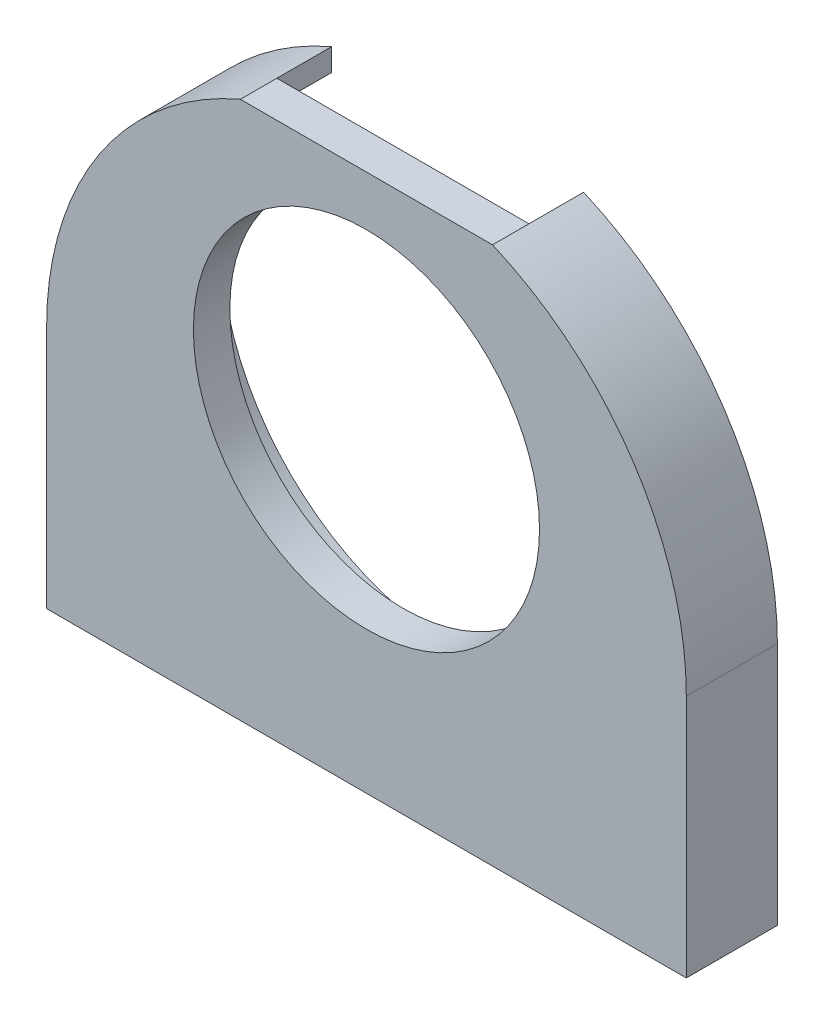
ISO-10303-21;
HEADER;
FILE_DESCRIPTION(('STEP AP214'),'2;1');
FILE_NAME('part.step','',(''),(''),'','','');
FILE_SCHEMA(('AUTOMOTIVE_DESIGN { 1 0 10303 214 1 1 1 1 }'));
ENDSEC;
DATA;
#1=APPLICATION_CONTEXT('core data for automotive mechanical design processes');
#2=APPLICATION_PROTOCOL_DEFINITION('international standard','automotive_design',2000,#1);
#3=PRODUCT_CONTEXT('',#1,'mechanical');
#4=PRODUCT('Part','Part','',(#3));
#5=PRODUCT_RELATED_PRODUCT_CATEGORY('part','',(#4));
#6=PRODUCT_DEFINITION_FORMATION('','',#4);
#7=PRODUCT_DEFINITION_CONTEXT('part definition',#1,'design');
#8=PRODUCT_DEFINITION('design','',#6,#7);
#9=PRODUCT_DEFINITION_SHAPE('','',#8);
#10=(LENGTH_UNIT() NAMED_UNIT(*) SI_UNIT(.MILLI.,.METRE.));
#11=(NAMED_UNIT(*) PLANE_ANGLE_UNIT() SI_UNIT($,.RADIAN.));
#12=(NAMED_UNIT(*) SI_UNIT($,.STERADIAN.) SOLID_ANGLE_UNIT());
#13=UNCERTAINTY_MEASURE_WITH_UNIT(LENGTH_MEASURE(1.E-05),#10,'distance_accuracy_value','');
#14=(GEOMETRIC_REPRESENTATION_CONTEXT(3) GLOBAL_UNCERTAINTY_ASSIGNED_CONTEXT((#13)) GLOBAL_UNIT_ASSIGNED_CONTEXT((#10,
#11,#12)) REPRESENTATION_CONTEXT('',''));
#15=CARTESIAN_POINT('',(0.,0.,0.));
#16=DIRECTION('',(0.,0.,1.));
#17=DIRECTION('',(1.,0.,0.));
#18=AXIS2_PLACEMENT_3D('',#15,#16,#17);
#19=CARTESIAN_POINT('',(8.78,8.5,1.5));
#20=DIRECTION('',(0.,0.,-1.));
#21=DIRECTION('',(-1.,0.,0.));
#22=AXIS2_PLACEMENT_3D('',#19,#20,#21);
#23=CYLINDRICAL_SURFACE('',#22,6.5);
#24=CARTESIAN_POINT('',(8.78,8.5,0.));
#25=DIRECTION('',(0.,0.,1.));
#26=DIRECTION('',(1.,0.,0.));
#27=AXIS2_PLACEMENT_3D('',#24,#25,#26);
#28=CIRCLE('',#27,6.5);
#29=CARTESIAN_POINT('',(5.32,14.0025812124856,0.));
#30=VERTEX_POINT('',#29);
#31=CARTESIAN_POINT('',(12.24,14.0025812124856,0.));
#32=VERTEX_POINT('',#31);
#33=EDGE_CURVE('E99',#30,#32,#28,.T.);
#34=ORIENTED_EDGE('',*,*,#33,.F.);
#35=DIRECTION('',(0.,0.,-1.));
#36=VECTOR('',#35,1.);
#37=CARTESIAN_POINT('',(5.32,14.0025812124856,1.5));
#38=LINE('',#37,#36);
#39=CARTESIAN_POINT('',(5.32,14.0025812124856,1.5));
#40=VERTEX_POINT('',#39);
#41=EDGE_CURVE('E11',#40,#30,#38,.T.);
#42=ORIENTED_EDGE('',*,*,#41,.F.);
#43=CARTESIAN_POINT('',(8.78,8.5,1.5));
#44=DIRECTION('',(0.,0.,1.));
#45=DIRECTION('',(1.,0.,0.));
#46=AXIS2_PLACEMENT_3D('',#43,#44,#45);
#47=CIRCLE('',#46,6.5);
#48=CARTESIAN_POINT('',(12.24,14.0025812124856,1.5));
#49=VERTEX_POINT('',#48);
#50=EDGE_CURVE('E100',#40,#49,#47,.T.);
#51=ORIENTED_EDGE('',*,*,#50,.T.);
#52=DIRECTION('',(0.,0.,-1.));
#53=VECTOR('',#52,1.);
#54=CARTESIAN_POINT('',(12.24,14.0025812124856,1.5));
#55=LINE('',#54,#53);
#56=EDGE_CURVE('E83',#49,#32,#55,.T.);
#57=ORIENTED_EDGE('',*,*,#56,.T.);
#58=EDGE_LOOP('',(#34,#42,#51,#57));
#59=FACE_BOUND('',#58,.T.);
#60=ADVANCED_FACE('F35',(#59),#23,.F.);
#61=CARTESIAN_POINT('',(5.32,0.,1.5));
#62=DIRECTION('',(-1.,0.,0.));
#63=DIRECTION('',(0.,0.,1.));
#64=AXIS2_PLACEMENT_3D('',#61,#62,#63);
#65=PLANE('',#64);
#66=DIRECTION('',(0.,1.,0.));
#67=VECTOR('',#66,1.);
#68=CARTESIAN_POINT('',(5.32,0.,0.));
#69=LINE('',#68,#67);
#70=CARTESIAN_POINT('',(5.32,14.6194981256581,0.));
#71=VERTEX_POINT('',#70);
#72=EDGE_CURVE('E126',#30,#71,#69,.T.);
#73=ORIENTED_EDGE('',*,*,#72,.T.);
#74=DIRECTION('',(0.,0.,-1.));
#75=VECTOR('',#74,1.);
#76=CARTESIAN_POINT('',(5.32,14.6194981256581,1.5));
#77=LINE('',#76,#75);
#78=CARTESIAN_POINT('',(5.32,14.6194981256581,1.5));
#79=VERTEX_POINT('',#78);
#80=EDGE_CURVE('E43',#79,#71,#77,.T.);
#81=ORIENTED_EDGE('',*,*,#80,.F.);
#82=DIRECTION('',(0.,1.,0.));
#83=VECTOR('',#82,1.);
#84=CARTESIAN_POINT('',(5.32,0.,1.5));
#85=LINE('',#84,#83);
#86=EDGE_CURVE('E103',#40,#79,#85,.T.);
#87=ORIENTED_EDGE('',*,*,#86,.F.);
#88=ORIENTED_EDGE('',*,*,#41,.T.);
#89=EDGE_LOOP('',(#73,#81,#87,#88));
#90=FACE_BOUND('',#89,.T.);
#91=ADVANCED_FACE('F192',(#90),#65,.F.);
#92=CARTESIAN_POINT('',(8.78,6.55,1.5));
#93=DIRECTION('',(0.,0.,-1.));
#94=DIRECTION('',(-1.,0.,0.));
#95=AXIS2_PLACEMENT_3D('',#92,#93,#94);
#96=CYLINDRICAL_SURFACE('',#95,8.78);
#97=CARTESIAN_POINT('',(8.78,6.55,0.));
#98=DIRECTION('',(0.,0.,1.));
#99=DIRECTION('',(1.,0.,0.));
#100=AXIS2_PLACEMENT_3D('',#97,#98,#99);
#101=CIRCLE('',#100,8.78);
#102=CARTESIAN_POINT('',(0.,6.55,0.));
#103=VERTEX_POINT('',#102);
#104=EDGE_CURVE('E118',#71,#103,#101,.T.);
#105=ORIENTED_EDGE('',*,*,#104,.T.);
#106=DIRECTION('',(0.,0.,-1.));
#107=VECTOR('',#106,1.);
#108=CARTESIAN_POINT('',(0.,6.55,1.5));
#109=LINE('',#108,#107);
#110=CARTESIAN_POINT('',(0.,6.55,2.5));
#111=VERTEX_POINT('',#110);
#112=EDGE_CURVE('E109',#111,#103,#109,.T.);
#113=ORIENTED_EDGE('',*,*,#112,.F.);
#114=CARTESIAN_POINT('',(8.78,6.55,2.5));
#115=DIRECTION('',(0.,0.,1.));
#116=DIRECTION('',(1.,0.,0.));
#117=AXIS2_PLACEMENT_3D('',#114,#115,#116);
#118=CIRCLE('',#117,8.78);
#119=CARTESIAN_POINT('',(5.32,14.6194981256581,2.5));
#120=VERTEX_POINT('',#119);
#121=EDGE_CURVE('E173',#120,#111,#118,.T.);
#122=ORIENTED_EDGE('',*,*,#121,.F.);
#123=DIRECTION('',(0.,0.,-1.));
#124=VECTOR('',#123,1.);
#125=CARTESIAN_POINT('',(5.32,14.6194981256581,2.5));
#126=LINE('',#125,#124);
#127=EDGE_CURVE('E123',#120,#79,#126,.T.);
#128=ORIENTED_EDGE('',*,*,#127,.T.);
#129=ORIENTED_EDGE('',*,*,#80,.T.);
#130=EDGE_LOOP('',(#105,#113,#122,#128,#129));
#131=FACE_BOUND('',#130,.T.);
#132=ADVANCED_FACE('F116',(#131),#96,.T.);
#133=CARTESIAN_POINT('',(0.,0.,1.5));
#134=DIRECTION('',(-1.,0.,0.));
#135=DIRECTION('',(0.,0.,1.));
#136=AXIS2_PLACEMENT_3D('',#133,#134,#135);
#137=PLANE('',#136);
#138=DIRECTION('',(0.,1.,0.));
#139=VECTOR('',#138,1.);
#140=CARTESIAN_POINT('',(0.,0.,0.));
#141=LINE('',#140,#139);
#142=CARTESIAN_POINT('',(0.,-0.15,0.));
#143=VERTEX_POINT('',#142);
#144=EDGE_CURVE('E129',#143,#103,#141,.T.);
#145=ORIENTED_EDGE('',*,*,#144,.F.);
#146=DIRECTION('',(0.,0.,-1.));
#147=VECTOR('',#146,1.);
#148=CARTESIAN_POINT('',(0.,-0.15,2.5));
#149=LINE('',#148,#147);
#150=CARTESIAN_POINT('',(0.,-0.15,2.5));
#151=VERTEX_POINT('',#150);
#152=EDGE_CURVE('E154',#151,#143,#149,.T.);
#153=ORIENTED_EDGE('',*,*,#152,.F.);
#154=DIRECTION('',(0.,-1.,0.));
#155=VECTOR('',#154,1.);
#156=CARTESIAN_POINT('',(0.,0.,2.5));
#157=LINE('',#156,#155);
#158=EDGE_CURVE('E176',#111,#151,#157,.T.);
#159=ORIENTED_EDGE('',*,*,#158,.F.);
#160=ORIENTED_EDGE('',*,*,#112,.T.);
#161=EDGE_LOOP('',(#145,#153,#159,#160));
#162=FACE_BOUND('',#161,.T.);
#163=ADVANCED_FACE('F204',(#162),#137,.T.);
#164=CARTESIAN_POINT('',(17.56,0.,1.5));
#165=DIRECTION('',(-1.,0.,0.));
#166=DIRECTION('',(0.,0.,1.));
#167=AXIS2_PLACEMENT_3D('',#164,#165,#166);
#168=PLANE('',#167);
#169=DIRECTION('',(0.,1.,0.));
#170=VECTOR('',#169,1.);
#171=CARTESIAN_POINT('',(17.56,0.,0.));
#172=LINE('',#171,#170);
#173=CARTESIAN_POINT('',(17.56,-0.15,0.));
#174=VERTEX_POINT('',#173);
#175=CARTESIAN_POINT('',(17.56,6.55,0.));
#176=VERTEX_POINT('',#175);
#177=EDGE_CURVE('E93',#174,#176,#172,.T.);
#178=ORIENTED_EDGE('',*,*,#177,.T.);
#179=DIRECTION('',(0.,0.,-1.));
#180=VECTOR('',#179,1.);
#181=CARTESIAN_POINT('',(17.56,6.55,1.5));
#182=LINE('',#181,#180);
#183=CARTESIAN_POINT('',(17.56,6.55,2.5));
#184=VERTEX_POINT('',#183);
#185=EDGE_CURVE('E82',#184,#176,#182,.T.);
#186=ORIENTED_EDGE('',*,*,#185,.F.);
#187=DIRECTION('',(0.,1.,0.));
#188=VECTOR('',#187,1.);
#189=CARTESIAN_POINT('',(17.56,0.,2.5));
#190=LINE('',#189,#188);
#191=CARTESIAN_POINT('',(17.56,-0.15,2.5));
#192=VERTEX_POINT('',#191);
#193=EDGE_CURVE('E179',#192,#184,#190,.T.);
#194=ORIENTED_EDGE('',*,*,#193,.F.);
#195=DIRECTION('',(0.,0.,1.));
#196=VECTOR('',#195,1.);
#197=CARTESIAN_POINT('',(17.56,-0.15,2.5));
#198=LINE('',#197,#196);
#199=EDGE_CURVE('E142',#174,#192,#198,.T.);
#200=ORIENTED_EDGE('',*,*,#199,.F.);
#201=EDGE_LOOP('',(#178,#186,#194,#200));
#202=FACE_BOUND('',#201,.T.);
#203=ADVANCED_FACE('F136',(#202),#168,.F.);
#204=CARTESIAN_POINT('',(8.78,6.55,1.5));
#205=DIRECTION('',(0.,0.,-1.));
#206=DIRECTION('',(-1.,0.,0.));
#207=AXIS2_PLACEMENT_3D('',#204,#205,#206);
#208=CYLINDRICAL_SURFACE('',#207,8.78);
#209=CARTESIAN_POINT('',(8.78,6.55,0.));
#210=DIRECTION('',(0.,0.,1.));
#211=DIRECTION('',(1.,0.,0.));
#212=AXIS2_PLACEMENT_3D('',#209,#210,#211);
#213=CIRCLE('',#212,8.78);
#214=CARTESIAN_POINT('',(12.24,14.6194981256581,0.));
#215=VERTEX_POINT('',#214);
#216=EDGE_CURVE('E87',#176,#215,#213,.T.);
#217=ORIENTED_EDGE('',*,*,#216,.T.);
#218=DIRECTION('',(0.,0.,-1.));
#219=VECTOR('',#218,1.);
#220=CARTESIAN_POINT('',(12.24,14.6194981256581,1.5));
#221=LINE('',#220,#219);
#222=CARTESIAN_POINT('',(12.24,14.6194981256581,1.5));
#223=VERTEX_POINT('',#222);
#224=EDGE_CURVE('E73',#223,#215,#221,.T.);
#225=ORIENTED_EDGE('',*,*,#224,.F.);
#226=DIRECTION('',(0.,0.,-1.));
#227=VECTOR('',#226,1.);
#228=CARTESIAN_POINT('',(12.24,14.6194981256581,2.5));
#229=LINE('',#228,#227);
#230=CARTESIAN_POINT('',(12.24,14.6194981256581,2.5));
#231=VERTEX_POINT('',#230);
#232=EDGE_CURVE('E183',#231,#223,#229,.T.);
#233=ORIENTED_EDGE('',*,*,#232,.F.);
#234=CARTESIAN_POINT('',(8.78,6.55,2.5));
#235=DIRECTION('',(0.,0.,1.));
#236=DIRECTION('',(1.,0.,0.));
#237=AXIS2_PLACEMENT_3D('',#234,#235,#236);
#238=CIRCLE('',#237,8.78);
#239=EDGE_CURVE('E167',#184,#231,#238,.T.);
#240=ORIENTED_EDGE('',*,*,#239,.F.);
#241=ORIENTED_EDGE('',*,*,#185,.T.);
#242=EDGE_LOOP('',(#217,#225,#233,#240,#241));
#243=FACE_BOUND('',#242,.T.);
#244=ADVANCED_FACE('F88',(#243),#208,.T.);
#245=CARTESIAN_POINT('',(12.24,0.,1.5));
#246=DIRECTION('',(-1.,0.,0.));
#247=DIRECTION('',(0.,0.,1.));
#248=AXIS2_PLACEMENT_3D('',#245,#246,#247);
#249=PLANE('',#248);
#250=DIRECTION('',(0.,1.,0.));
#251=VECTOR('',#250,1.);
#252=CARTESIAN_POINT('',(12.24,0.,0.));
#253=LINE('',#252,#251);
#254=EDGE_CURVE('E78',#32,#215,#253,.T.);
#255=ORIENTED_EDGE('',*,*,#254,.F.);
#256=ORIENTED_EDGE('',*,*,#56,.F.);
#257=DIRECTION('',(0.,1.,0.));
#258=VECTOR('',#257,1.);
#259=CARTESIAN_POINT('',(12.24,0.,1.5));
#260=LINE('',#259,#258);
#261=EDGE_CURVE('E79',#49,#223,#260,.T.);
#262=ORIENTED_EDGE('',*,*,#261,.T.);
#263=ORIENTED_EDGE('',*,*,#224,.T.);
#264=EDGE_LOOP('',(#255,#256,#262,#263));
#265=FACE_BOUND('',#264,.T.);
#266=ADVANCED_FACE('F75',(#265),#249,.T.);
#267=CARTESIAN_POINT('',(0.,0.,0.));
#268=DIRECTION('',(0.,0.,1.));
#269=DIRECTION('',(1.,0.,0.));
#270=AXIS2_PLACEMENT_3D('',#267,#268,#269);
#271=PLANE('',#270);
#272=ORIENTED_EDGE('',*,*,#33,.T.);
#273=ORIENTED_EDGE('',*,*,#254,.T.);
#274=ORIENTED_EDGE('',*,*,#216,.F.);
#275=ORIENTED_EDGE('',*,*,#177,.F.);
#276=DIRECTION('',(1.,0.,0.));
#277=VECTOR('',#276,1.);
#278=CARTESIAN_POINT('',(0.,-0.15,0.));
#279=LINE('',#278,#277);
#280=EDGE_CURVE('E145',#143,#174,#279,.T.);
#281=ORIENTED_EDGE('',*,*,#280,.F.);
#282=ORIENTED_EDGE('',*,*,#144,.T.);
#283=ORIENTED_EDGE('',*,*,#104,.F.);
#284=ORIENTED_EDGE('',*,*,#72,.F.);
#285=EDGE_LOOP('',(#272,#273,#274,#275,#281,#282,#283,#284));
#286=FACE_BOUND('',#285,.T.);
#287=ADVANCED_FACE('F96',(#286),#271,.F.);
#288=CARTESIAN_POINT('',(0.,0.,1.5));
#289=DIRECTION('',(0.,0.,1.));
#290=DIRECTION('',(1.,0.,0.));
#291=AXIS2_PLACEMENT_3D('',#288,#289,#290);
#292=PLANE('',#291);
#293=CARTESIAN_POINT('',(8.78,8.5,1.5));
#294=DIRECTION('',(0.,0.,-1.));
#295=DIRECTION('',(-1.,0.,0.));
#296=AXIS2_PLACEMENT_3D('',#293,#294,#295);
#297=CIRCLE('',#296,4.75);
#298=CARTESIAN_POINT('',(4.03,8.5,1.5));
#299=VERTEX_POINT('',#298);
#300=EDGE_CURVE('E161',#299,#299,#297,.T.);
#301=ORIENTED_EDGE('',*,*,#300,.F.);
#302=EDGE_LOOP('',(#301));
#303=FACE_BOUND('',#302,.T.);
#304=ORIENTED_EDGE('',*,*,#50,.F.);
#305=ORIENTED_EDGE('',*,*,#86,.T.);
#306=DIRECTION('',(1.,0.,0.));
#307=VECTOR('',#306,1.);
#308=CARTESIAN_POINT('',(0.,14.6194981256581,1.5));
#309=LINE('',#308,#307);
#310=EDGE_CURVE('E50',#79,#223,#309,.T.);
#311=ORIENTED_EDGE('',*,*,#310,.T.);
#312=ORIENTED_EDGE('',*,*,#261,.F.);
#313=EDGE_LOOP('',(#304,#305,#311,#312));
#314=FACE_BOUND('',#313,.T.);
#315=ADVANCED_FACE('F187',(#303,#314),#292,.F.);
#316=CARTESIAN_POINT('',(0.,14.6194981256581,2.5));
#317=DIRECTION('',(0.,1.,0.));
#318=DIRECTION('',(0.,0.,1.));
#319=AXIS2_PLACEMENT_3D('',#316,#317,#318);
#320=PLANE('',#319);
#321=ORIENTED_EDGE('',*,*,#310,.F.);
#322=ORIENTED_EDGE('',*,*,#127,.F.);
#323=DIRECTION('',(1.,0.,0.));
#324=VECTOR('',#323,1.);
#325=CARTESIAN_POINT('',(0.,14.6194981256581,2.5));
#326=LINE('',#325,#324);
#327=EDGE_CURVE('E170',#120,#231,#326,.T.);
#328=ORIENTED_EDGE('',*,*,#327,.T.);
#329=ORIENTED_EDGE('',*,*,#232,.T.);
#330=EDGE_LOOP('',(#321,#322,#328,#329));
#331=FACE_BOUND('',#330,.T.);
#332=ADVANCED_FACE('F210',(#331),#320,.T.);
#333=CARTESIAN_POINT('',(0.,0.,2.5));
#334=DIRECTION('',(0.,0.,1.));
#335=DIRECTION('',(1.,0.,0.));
#336=AXIS2_PLACEMENT_3D('',#333,#334,#335);
#337=PLANE('',#336);
#338=CARTESIAN_POINT('',(8.78,8.5,2.5));
#339=DIRECTION('',(0.,0.,-1.));
#340=DIRECTION('',(-1.,0.,0.));
#341=AXIS2_PLACEMENT_3D('',#338,#339,#340);
#342=CIRCLE('',#341,4.75);
#343=CARTESIAN_POINT('',(4.03,8.5,2.5));
#344=VERTEX_POINT('',#343);
#345=EDGE_CURVE('E162',#344,#344,#342,.T.);
#346=ORIENTED_EDGE('',*,*,#345,.T.);
#347=EDGE_LOOP('',(#346));
#348=FACE_BOUND('',#347,.T.);
#349=ORIENTED_EDGE('',*,*,#239,.T.);
#350=ORIENTED_EDGE('',*,*,#327,.F.);
#351=ORIENTED_EDGE('',*,*,#121,.T.);
#352=ORIENTED_EDGE('',*,*,#158,.T.);
#353=DIRECTION('',(-1.,0.,0.));
#354=VECTOR('',#353,1.);
#355=CARTESIAN_POINT('',(0.,-0.15,2.5));
#356=LINE('',#355,#354);
#357=EDGE_CURVE('E156',#192,#151,#356,.T.);
#358=ORIENTED_EDGE('',*,*,#357,.F.);
#359=ORIENTED_EDGE('',*,*,#193,.T.);
#360=EDGE_LOOP('',(#349,#350,#351,#352,#358,#359));
#361=FACE_BOUND('',#360,.T.);
#362=ADVANCED_FACE('F208',(#348,#361),#337,.T.);
#363=CARTESIAN_POINT('',(8.78,8.5,2.5));
#364=DIRECTION('',(0.,0.,-1.));
#365=DIRECTION('',(-1.,0.,0.));
#366=AXIS2_PLACEMENT_3D('',#363,#364,#365);
#367=CYLINDRICAL_SURFACE('',#366,4.75);
#368=ORIENTED_EDGE('',*,*,#345,.F.);
#369=EDGE_LOOP('',(#368));
#370=FACE_BOUND('',#369,.T.);
#371=ORIENTED_EDGE('',*,*,#300,.T.);
#372=EDGE_LOOP('',(#371));
#373=FACE_BOUND('',#372,.T.);
#374=ADVANCED_FACE('F218',(#370,#373),#367,.F.);
#375=CARTESIAN_POINT('',(0.,-0.15,0.));
#376=DIRECTION('',(0.,-1.,0.));
#377=DIRECTION('',(0.,0.,-1.));
#378=AXIS2_PLACEMENT_3D('',#375,#376,#377);
#379=PLANE('',#378);
#380=ORIENTED_EDGE('',*,*,#152,.T.);
#381=ORIENTED_EDGE('',*,*,#280,.T.);
#382=ORIENTED_EDGE('',*,*,#199,.T.);
#383=ORIENTED_EDGE('',*,*,#357,.T.);
#384=EDGE_LOOP('',(#380,#381,#382,#383));
#385=FACE_BOUND('',#384,.T.);
#386=ADVANCED_FACE('F150',(#385),#379,.T.);
#387=CLOSED_SHELL('',(#60,#91,#132,#163,#203,#244,#266,#287,#315,#332,#362,#374,#386));
#388=MANIFOLD_SOLID_BREP('B2',#387);
#389=ADVANCED_BREP_SHAPE_REPRESENTATION('',(#18,#388),#14);
#390=SHAPE_DEFINITION_REPRESENTATION(#9,#389);
ENDSEC;
END-ISO-10303-21;
